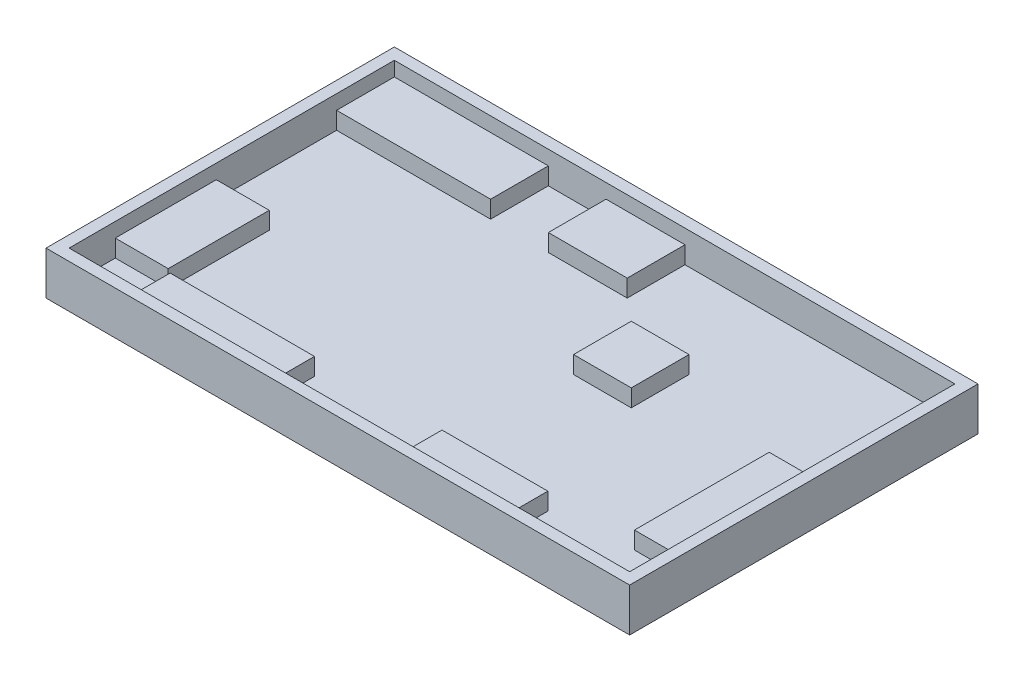
ISO-10303-21;
HEADER;
FILE_DESCRIPTION(('STEP AP214'),'2;1');
FILE_NAME('part.step','',(''),(''),'','','');
FILE_SCHEMA(('AUTOMOTIVE_DESIGN { 1 0 10303 214 1 1 1 1 }'));
ENDSEC;
DATA;
#1=APPLICATION_CONTEXT('core data for automotive mechanical design processes');
#2=APPLICATION_PROTOCOL_DEFINITION('international standard','automotive_design',2000,#1);
#3=PRODUCT_CONTEXT('',#1,'mechanical');
#4=PRODUCT('Part','Part','',(#3));
#5=PRODUCT_RELATED_PRODUCT_CATEGORY('part','',(#4));
#6=PRODUCT_DEFINITION_FORMATION('','',#4);
#7=PRODUCT_DEFINITION_CONTEXT('part definition',#1,'design');
#8=PRODUCT_DEFINITION('design','',#6,#7);
#9=PRODUCT_DEFINITION_SHAPE('','',#8);
#10=(LENGTH_UNIT() NAMED_UNIT(*) SI_UNIT(.MILLI.,.METRE.));
#11=(NAMED_UNIT(*) PLANE_ANGLE_UNIT() SI_UNIT($,.RADIAN.));
#12=(NAMED_UNIT(*) SI_UNIT($,.STERADIAN.) SOLID_ANGLE_UNIT());
#13=UNCERTAINTY_MEASURE_WITH_UNIT(LENGTH_MEASURE(1.E-05),#10,'distance_accuracy_value','');
#14=(GEOMETRIC_REPRESENTATION_CONTEXT(3) GLOBAL_UNCERTAINTY_ASSIGNED_CONTEXT((#13)) GLOBAL_UNIT_ASSIGNED_CONTEXT((#10,
#11,#12)) REPRESENTATION_CONTEXT('',''));
#15=CARTESIAN_POINT('',(0.,0.,0.));
#16=DIRECTION('',(0.,0.,1.));
#17=DIRECTION('',(1.,0.,0.));
#18=AXIS2_PLACEMENT_3D('',#15,#16,#17);
#19=CARTESIAN_POINT('',(0.,1.2,0.));
#20=DIRECTION('',(0.,1.,0.));
#21=DIRECTION('',(0.,0.,1.));
#22=AXIS2_PLACEMENT_3D('',#19,#20,#21);
#23=PLANE('',#22);
#24=DIRECTION('',(1.,0.,0.));
#25=VECTOR('',#24,1.);
#26=CARTESIAN_POINT('',(22.,1.2,-27.8));
#27=LINE('',#26,#25);
#28=CARTESIAN_POINT('',(22.,1.2,-27.8));
#29=VERTEX_POINT('',#28);
#30=CARTESIAN_POINT('',(30.2,1.2,-27.8));
#31=VERTEX_POINT('',#30);
#32=EDGE_CURVE('E63',#29,#31,#27,.T.);
#33=ORIENTED_EDGE('',*,*,#32,.F.);
#34=DIRECTION('',(0.,0.,1.));
#35=VECTOR('',#34,1.);
#36=CARTESIAN_POINT('',(22.,1.2,-33.8));
#37=LINE('',#36,#35);
#38=CARTESIAN_POINT('',(22.,1.2,-33.8));
#39=VERTEX_POINT('',#38);
#40=EDGE_CURVE('E295',#39,#29,#37,.T.);
#41=ORIENTED_EDGE('',*,*,#40,.F.);
#42=DIRECTION('',(-1.,0.,0.));
#43=VECTOR('',#42,1.);
#44=CARTESIAN_POINT('',(0.,1.2,-33.8));
#45=LINE('',#44,#43);
#46=CARTESIAN_POINT('',(16.,1.2,-33.8));
#47=VERTEX_POINT('',#46);
#48=EDGE_CURVE('E554',#39,#47,#45,.T.);
#49=ORIENTED_EDGE('',*,*,#48,.T.);
#50=DIRECTION('',(0.,0.,-1.));
#51=VECTOR('',#50,1.);
#52=CARTESIAN_POINT('',(16.,1.2,-33.8));
#53=LINE('',#52,#51);
#54=CARTESIAN_POINT('',(16.,1.2,-27.8));
#55=VERTEX_POINT('',#54);
#56=EDGE_CURVE('E498',#55,#47,#53,.T.);
#57=ORIENTED_EDGE('',*,*,#56,.F.);
#58=DIRECTION('',(1.,0.,0.));
#59=VECTOR('',#58,1.);
#60=CARTESIAN_POINT('',(0.,1.2,-27.8));
#61=LINE('',#60,#59);
#62=CARTESIAN_POINT('',(0.,1.2,-27.8));
#63=VERTEX_POINT('',#62);
#64=EDGE_CURVE('E492',#63,#55,#61,.T.);
#65=ORIENTED_EDGE('',*,*,#64,.F.);
#66=DIRECTION('',(0.,0.,1.));
#67=VECTOR('',#66,1.);
#68=CARTESIAN_POINT('',(0.,1.2,-33.8));
#69=LINE('',#68,#67);
#70=CARTESIAN_POINT('',(0.,1.2,-15.3));
#71=VERTEX_POINT('',#70);
#72=EDGE_CURVE('E539',#63,#71,#69,.T.);
#73=ORIENTED_EDGE('',*,*,#72,.T.);
#74=DIRECTION('',(-1.,0.,0.));
#75=VECTOR('',#74,1.);
#76=CARTESIAN_POINT('',(0.,1.2,-15.3));
#77=LINE('',#76,#75);
#78=CARTESIAN_POINT('',(5.5,1.2,-15.3));
#79=VERTEX_POINT('',#78);
#80=EDGE_CURVE('E461',#79,#71,#77,.T.);
#81=ORIENTED_EDGE('',*,*,#80,.F.);
#82=DIRECTION('',(0.,0.,-1.));
#83=VECTOR('',#82,1.);
#84=CARTESIAN_POINT('',(5.5,1.2,-4.8));
#85=LINE('',#84,#83);
#86=CARTESIAN_POINT('',(5.5,1.2,-4.8));
#87=VERTEX_POINT('',#86);
#88=EDGE_CURVE('E473',#87,#79,#85,.T.);
#89=ORIENTED_EDGE('',*,*,#88,.F.);
#90=DIRECTION('',(1.,0.,0.));
#91=VECTOR('',#90,1.);
#92=CARTESIAN_POINT('',(0.,1.2,-4.8));
#93=LINE('',#92,#91);
#94=CARTESIAN_POINT('',(0.,1.2,-4.8));
#95=VERTEX_POINT('',#94);
#96=EDGE_CURVE('E455',#95,#87,#93,.T.);
#97=ORIENTED_EDGE('',*,*,#96,.F.);
#98=CARTESIAN_POINT('',(0.,1.2,0.));
#99=VERTEX_POINT('',#98);
#100=EDGE_CURVE('E523',#95,#99,#69,.T.);
#101=ORIENTED_EDGE('',*,*,#100,.T.);
#102=DIRECTION('',(1.,0.,0.));
#103=VECTOR('',#102,1.);
#104=CARTESIAN_POINT('',(0.,1.2,0.));
#105=LINE('',#104,#103);
#106=CARTESIAN_POINT('',(6.,1.2,0.));
#107=VERTEX_POINT('',#106);
#108=EDGE_CURVE('E544',#99,#107,#105,.T.);
#109=ORIENTED_EDGE('',*,*,#108,.T.);
#110=DIRECTION('',(0.,0.,1.));
#111=VECTOR('',#110,1.);
#112=CARTESIAN_POINT('',(6.,1.2,0.));
#113=LINE('',#112,#111);
#114=CARTESIAN_POINT('',(6.,1.2,-4.5));
#115=VERTEX_POINT('',#114);
#116=EDGE_CURVE('E339',#115,#107,#113,.T.);
#117=ORIENTED_EDGE('',*,*,#116,.F.);
#118=DIRECTION('',(-1.,0.,0.));
#119=VECTOR('',#118,1.);
#120=CARTESIAN_POINT('',(6.,1.2,-4.5));
#121=LINE('',#120,#119);
#122=CARTESIAN_POINT('',(21.,1.2,-4.5));
#123=VERTEX_POINT('',#122);
#124=EDGE_CURVE('E345',#123,#115,#121,.T.);
#125=ORIENTED_EDGE('',*,*,#124,.F.);
#126=DIRECTION('',(0.,0.,-1.));
#127=VECTOR('',#126,1.);
#128=CARTESIAN_POINT('',(21.,1.2,0.));
#129=LINE('',#128,#127);
#130=CARTESIAN_POINT('',(21.,1.2,0.));
#131=VERTEX_POINT('',#130);
#132=EDGE_CURVE('E357',#131,#123,#129,.T.);
#133=ORIENTED_EDGE('',*,*,#132,.F.);
#134=CARTESIAN_POINT('',(34.25,1.2,0.));
#135=VERTEX_POINT('',#134);
#136=EDGE_CURVE('E549',#131,#135,#105,.T.);
#137=ORIENTED_EDGE('',*,*,#136,.T.);
#138=DIRECTION('',(0.,0.,1.));
#139=VECTOR('',#138,1.);
#140=CARTESIAN_POINT('',(34.25,1.2,0.));
#141=LINE('',#140,#139);
#142=CARTESIAN_POINT('',(34.25,1.2,-4.5));
#143=VERTEX_POINT('',#142);
#144=EDGE_CURVE('E417',#143,#135,#141,.T.);
#145=ORIENTED_EDGE('',*,*,#144,.F.);
#146=DIRECTION('',(-1.,0.,0.));
#147=VECTOR('',#146,1.);
#148=CARTESIAN_POINT('',(34.25,1.2,-4.5));
#149=LINE('',#148,#147);
#150=CARTESIAN_POINT('',(45.25,1.2,-4.5));
#151=VERTEX_POINT('',#150);
#152=EDGE_CURVE('E423',#151,#143,#149,.T.);
#153=ORIENTED_EDGE('',*,*,#152,.F.);
#154=DIRECTION('',(0.,0.,-1.));
#155=VECTOR('',#154,1.);
#156=CARTESIAN_POINT('',(45.25,1.2,0.));
#157=LINE('',#156,#155);
#158=CARTESIAN_POINT('',(45.25,1.2,0.));
#159=VERTEX_POINT('',#158);
#160=EDGE_CURVE('E436',#159,#151,#157,.T.);
#161=ORIENTED_EDGE('',*,*,#160,.F.);
#162=CARTESIAN_POINT('',(58.25,1.2,0.));
#163=VERTEX_POINT('',#162);
#164=EDGE_CURVE('E543',#159,#163,#105,.T.);
#165=ORIENTED_EDGE('',*,*,#164,.T.);
#166=DIRECTION('',(0.,0.,-1.));
#167=VECTOR('',#166,1.);
#168=CARTESIAN_POINT('',(58.25,1.2,-33.8));
#169=LINE('',#168,#167);
#170=CARTESIAN_POINT('',(58.25,1.2,-5.5));
#171=VERTEX_POINT('',#170);
#172=EDGE_CURVE('E550',#163,#171,#169,.T.);
#173=ORIENTED_EDGE('',*,*,#172,.T.);
#174=DIRECTION('',(1.,0.,0.));
#175=VECTOR('',#174,1.);
#176=CARTESIAN_POINT('',(58.25,1.2,-5.5));
#177=LINE('',#176,#175);
#178=CARTESIAN_POINT('',(53.25,1.2,-5.5));
#179=VERTEX_POINT('',#178);
#180=EDGE_CURVE('E382',#179,#171,#177,.T.);
#181=ORIENTED_EDGE('',*,*,#180,.F.);
#182=DIRECTION('',(0.,0.,1.));
#183=VECTOR('',#182,1.);
#184=CARTESIAN_POINT('',(53.25,1.2,-5.5));
#185=LINE('',#184,#183);
#186=CARTESIAN_POINT('',(53.25,1.2,-19.5));
#187=VERTEX_POINT('',#186);
#188=EDGE_CURVE('E396',#187,#179,#185,.T.);
#189=ORIENTED_EDGE('',*,*,#188,.F.);
#190=DIRECTION('',(-1.,0.,0.));
#191=VECTOR('',#190,1.);
#192=CARTESIAN_POINT('',(58.25,1.2,-19.5));
#193=LINE('',#192,#191);
#194=CARTESIAN_POINT('',(58.25,1.2,-19.5));
#195=VERTEX_POINT('',#194);
#196=EDGE_CURVE('E376',#195,#187,#193,.T.);
#197=ORIENTED_EDGE('',*,*,#196,.F.);
#198=CARTESIAN_POINT('',(58.25,1.2,-33.8));
#199=VERTEX_POINT('',#198);
#200=EDGE_CURVE('E548',#195,#199,#169,.T.);
#201=ORIENTED_EDGE('',*,*,#200,.T.);
#202=CARTESIAN_POINT('',(30.2,1.2,-33.8));
#203=VERTEX_POINT('',#202);
#204=EDGE_CURVE('E528',#199,#203,#45,.T.);
#205=ORIENTED_EDGE('',*,*,#204,.T.);
#206=DIRECTION('',(0.,0.,-1.));
#207=VECTOR('',#206,1.);
#208=CARTESIAN_POINT('',(30.2,1.2,-33.8));
#209=LINE('',#208,#207);
#210=EDGE_CURVE('E309',#31,#203,#209,.T.);
#211=ORIENTED_EDGE('',*,*,#210,.F.);
#212=EDGE_LOOP('',(#33,#41,#49,#57,#65,#73,#81,#89,#97,#101,#109,#117,#125,#133,#137,#145,#153,
#161,#165,#173,#181,#189,#197,#201,#205,#211));
#213=FACE_BOUND('',#212,.T.);
#214=DIRECTION('',(1.,0.,0.));
#215=VECTOR('',#214,1.);
#216=CARTESIAN_POINT('',(34.29,1.2,-18.13));
#217=LINE('',#216,#215);
#218=CARTESIAN_POINT('',(34.29,1.2,-18.13));
#219=VERTEX_POINT('',#218);
#220=CARTESIAN_POINT('',(40.29,1.2,-18.13));
#221=VERTEX_POINT('',#220);
#222=EDGE_CURVE('E1088',#219,#221,#217,.T.);
#223=ORIENTED_EDGE('',*,*,#222,.F.);
#224=DIRECTION('',(0.,0.,1.));
#225=VECTOR('',#224,1.);
#226=CARTESIAN_POINT('',(34.29,1.2,-24.13));
#227=LINE('',#226,#225);
#228=CARTESIAN_POINT('',(34.29,1.2,-24.13));
#229=VERTEX_POINT('',#228);
#230=EDGE_CURVE('E292',#229,#219,#227,.T.);
#231=ORIENTED_EDGE('',*,*,#230,.F.);
#232=DIRECTION('',(-1.,0.,0.));
#233=VECTOR('',#232,1.);
#234=CARTESIAN_POINT('',(34.29,1.2,-24.13));
#235=LINE('',#234,#233);
#236=CARTESIAN_POINT('',(40.29,1.2,-24.13));
#237=VERTEX_POINT('',#236);
#238=EDGE_CURVE('E288',#237,#229,#235,.T.);
#239=ORIENTED_EDGE('',*,*,#238,.F.);
#240=DIRECTION('',(0.,0.,-1.));
#241=VECTOR('',#240,1.);
#242=CARTESIAN_POINT('',(40.29,1.2,-24.13));
#243=LINE('',#242,#241);
#244=EDGE_CURVE('E1084',#221,#237,#243,.T.);
#245=ORIENTED_EDGE('',*,*,#244,.F.);
#246=EDGE_LOOP('',(#223,#231,#239,#245));
#247=FACE_BOUND('',#246,.T.);
#248=ADVANCED_FACE('F39',(#213,#247),#23,.T.);
#249=CARTESIAN_POINT('',(0.,4.5,-33.8));
#250=DIRECTION('',(0.,0.,1.));
#251=DIRECTION('',(1.,0.,0.));
#252=AXIS2_PLACEMENT_3D('',#249,#250,#251);
#253=PLANE('',#252);
#254=ORIENTED_EDGE('',*,*,#48,.F.);
#255=DIRECTION('',(0.,-1.,0.));
#256=VECTOR('',#255,1.);
#257=CARTESIAN_POINT('',(22.,3.,-33.8));
#258=LINE('',#257,#256);
#259=CARTESIAN_POINT('',(22.,3.,-33.8));
#260=VERTEX_POINT('',#259);
#261=EDGE_CURVE('E319',#260,#39,#258,.T.);
#262=ORIENTED_EDGE('',*,*,#261,.F.);
#263=DIRECTION('',(-1.,0.,0.));
#264=VECTOR('',#263,1.);
#265=CARTESIAN_POINT('',(22.,3.,-33.8));
#266=LINE('',#265,#264);
#267=CARTESIAN_POINT('',(30.2,3.,-33.8));
#268=VERTEX_POINT('',#267);
#269=EDGE_CURVE('E316',#268,#260,#266,.T.);
#270=ORIENTED_EDGE('',*,*,#269,.F.);
#271=DIRECTION('',(0.,-1.,0.));
#272=VECTOR('',#271,1.);
#273=CARTESIAN_POINT('',(30.2,3.,-33.8));
#274=LINE('',#273,#272);
#275=EDGE_CURVE('E329',#268,#203,#274,.T.);
#276=ORIENTED_EDGE('',*,*,#275,.T.);
#277=ORIENTED_EDGE('',*,*,#204,.F.);
#278=DIRECTION('',(0.,-1.,0.));
#279=VECTOR('',#278,1.);
#280=CARTESIAN_POINT('',(58.25,4.5,-33.8));
#281=LINE('',#280,#279);
#282=CARTESIAN_POINT('',(58.25,4.5,-33.8));
#283=VERTEX_POINT('',#282);
#284=EDGE_CURVE('E561',#283,#199,#281,.T.);
#285=ORIENTED_EDGE('',*,*,#284,.F.);
#286=DIRECTION('',(-1.,0.,0.));
#287=VECTOR('',#286,1.);
#288=CARTESIAN_POINT('',(0.,4.5,-33.8));
#289=LINE('',#288,#287);
#290=CARTESIAN_POINT('',(0.,4.5,-33.8));
#291=VERTEX_POINT('',#290);
#292=EDGE_CURVE('E535',#283,#291,#289,.T.);
#293=ORIENTED_EDGE('',*,*,#292,.T.);
#294=DIRECTION('',(0.,-1.,0.));
#295=VECTOR('',#294,1.);
#296=CARTESIAN_POINT('',(0.,4.5,-33.8));
#297=LINE('',#296,#295);
#298=CARTESIAN_POINT('',(0.,3.,-33.8));
#299=VERTEX_POINT('',#298);
#300=EDGE_CURVE('E538',#291,#299,#297,.T.);
#301=ORIENTED_EDGE('',*,*,#300,.T.);
#302=DIRECTION('',(-1.,0.,0.));
#303=VECTOR('',#302,1.);
#304=CARTESIAN_POINT('',(0.,3.,-33.8));
#305=LINE('',#304,#303);
#306=CARTESIAN_POINT('',(16.,3.,-33.8));
#307=VERTEX_POINT('',#306);
#308=EDGE_CURVE('E504',#307,#299,#305,.T.);
#309=ORIENTED_EDGE('',*,*,#308,.F.);
#310=DIRECTION('',(0.,-1.,0.));
#311=VECTOR('',#310,1.);
#312=CARTESIAN_POINT('',(16.,3.,-33.8));
#313=LINE('',#312,#311);
#314=EDGE_CURVE('E507',#307,#47,#313,.T.);
#315=ORIENTED_EDGE('',*,*,#314,.T.);
#316=EDGE_LOOP('',(#254,#262,#270,#276,#277,#285,#293,#301,#309,#315));
#317=FACE_BOUND('',#316,.T.);
#318=ADVANCED_FACE('F638',(#317),#253,.T.);
#319=CARTESIAN_POINT('',(0.,4.5,0.));
#320=DIRECTION('',(0.,0.,-1.));
#321=DIRECTION('',(-1.,0.,0.));
#322=AXIS2_PLACEMENT_3D('',#319,#320,#321);
#323=PLANE('',#322);
#324=DIRECTION('',(1.,0.,0.));
#325=VECTOR('',#324,1.);
#326=CARTESIAN_POINT('',(6.,3.,0.));
#327=LINE('',#326,#325);
#328=CARTESIAN_POINT('',(6.,3.,0.));
#329=VERTEX_POINT('',#328);
#330=CARTESIAN_POINT('',(21.,3.,0.));
#331=VERTEX_POINT('',#330);
#332=EDGE_CURVE('E344',#329,#331,#327,.T.);
#333=ORIENTED_EDGE('',*,*,#332,.F.);
#334=DIRECTION('',(0.,-1.,0.));
#335=VECTOR('',#334,1.);
#336=CARTESIAN_POINT('',(6.,3.,0.));
#337=LINE('',#336,#335);
#338=EDGE_CURVE('E372',#329,#107,#337,.T.);
#339=ORIENTED_EDGE('',*,*,#338,.T.);
#340=ORIENTED_EDGE('',*,*,#108,.F.);
#341=DIRECTION('',(0.,-1.,0.));
#342=VECTOR('',#341,1.);
#343=CARTESIAN_POINT('',(0.,4.5,0.));
#344=LINE('',#343,#342);
#345=CARTESIAN_POINT('',(0.,4.5,0.));
#346=VERTEX_POINT('',#345);
#347=EDGE_CURVE('E569',#346,#99,#344,.T.);
#348=ORIENTED_EDGE('',*,*,#347,.F.);
#349=DIRECTION('',(1.,0.,0.));
#350=VECTOR('',#349,1.);
#351=CARTESIAN_POINT('',(0.,4.5,0.));
#352=LINE('',#351,#350);
#353=CARTESIAN_POINT('',(58.25,4.5,0.));
#354=VERTEX_POINT('',#353);
#355=EDGE_CURVE('E527',#346,#354,#352,.T.);
#356=ORIENTED_EDGE('',*,*,#355,.T.);
#357=DIRECTION('',(0.,-1.,0.));
#358=VECTOR('',#357,1.);
#359=CARTESIAN_POINT('',(58.25,4.5,0.));
#360=LINE('',#359,#358);
#361=EDGE_CURVE('E565',#354,#163,#360,.T.);
#362=ORIENTED_EDGE('',*,*,#361,.T.);
#363=ORIENTED_EDGE('',*,*,#164,.F.);
#364=DIRECTION('',(0.,-1.,0.));
#365=VECTOR('',#364,1.);
#366=CARTESIAN_POINT('',(45.25,3.,0.));
#367=LINE('',#366,#365);
#368=CARTESIAN_POINT('',(45.25,3.,0.));
#369=VERTEX_POINT('',#368);
#370=EDGE_CURVE('E448',#369,#159,#367,.T.);
#371=ORIENTED_EDGE('',*,*,#370,.F.);
#372=DIRECTION('',(1.,0.,0.));
#373=VECTOR('',#372,1.);
#374=CARTESIAN_POINT('',(34.25,3.,0.));
#375=LINE('',#374,#373);
#376=CARTESIAN_POINT('',(34.25,3.,0.));
#377=VERTEX_POINT('',#376);
#378=EDGE_CURVE('E422',#377,#369,#375,.T.);
#379=ORIENTED_EDGE('',*,*,#378,.F.);
#380=DIRECTION('',(0.,-1.,0.));
#381=VECTOR('',#380,1.);
#382=CARTESIAN_POINT('',(34.25,3.,0.));
#383=LINE('',#382,#381);
#384=EDGE_CURVE('E451',#377,#135,#383,.T.);
#385=ORIENTED_EDGE('',*,*,#384,.T.);
#386=ORIENTED_EDGE('',*,*,#136,.F.);
#387=DIRECTION('',(0.,-1.,0.));
#388=VECTOR('',#387,1.);
#389=CARTESIAN_POINT('',(21.,3.,0.));
#390=LINE('',#389,#388);
#391=EDGE_CURVE('E369',#331,#131,#390,.T.);
#392=ORIENTED_EDGE('',*,*,#391,.F.);
#393=EDGE_LOOP('',(#333,#339,#340,#348,#356,#362,#363,#371,#379,#385,#386,#392));
#394=FACE_BOUND('',#393,.T.);
#395=ADVANCED_FACE('F643',(#394),#323,.T.);
#396=CARTESIAN_POINT('',(58.25,4.5,-33.8));
#397=DIRECTION('',(-1.,0.,0.));
#398=DIRECTION('',(0.,0.,1.));
#399=AXIS2_PLACEMENT_3D('',#396,#397,#398);
#400=PLANE('',#399);
#401=ORIENTED_EDGE('',*,*,#200,.F.);
#402=DIRECTION('',(0.,-1.,0.));
#403=VECTOR('',#402,1.);
#404=CARTESIAN_POINT('',(58.25,3.,-19.5));
#405=LINE('',#404,#403);
#406=CARTESIAN_POINT('',(58.25,3.,-19.5));
#407=VERTEX_POINT('',#406);
#408=EDGE_CURVE('E413',#407,#195,#405,.T.);
#409=ORIENTED_EDGE('',*,*,#408,.F.);
#410=DIRECTION('',(0.,0.,-1.));
#411=VECTOR('',#410,1.);
#412=CARTESIAN_POINT('',(58.25,3.,-5.5));
#413=LINE('',#412,#411);
#414=CARTESIAN_POINT('',(58.25,3.,-5.5));
#415=VERTEX_POINT('',#414);
#416=EDGE_CURVE('E377',#415,#407,#413,.T.);
#417=ORIENTED_EDGE('',*,*,#416,.F.);
#418=DIRECTION('',(0.,-1.,0.));
#419=VECTOR('',#418,1.);
#420=CARTESIAN_POINT('',(58.25,3.,-5.5));
#421=LINE('',#420,#419);
#422=EDGE_CURVE('E392',#415,#171,#421,.T.);
#423=ORIENTED_EDGE('',*,*,#422,.T.);
#424=ORIENTED_EDGE('',*,*,#172,.F.);
#425=ORIENTED_EDGE('',*,*,#361,.F.);
#426=DIRECTION('',(0.,0.,-1.));
#427=VECTOR('',#426,1.);
#428=CARTESIAN_POINT('',(58.25,4.5,-33.8));
#429=LINE('',#428,#427);
#430=EDGE_CURVE('E531',#354,#283,#429,.T.);
#431=ORIENTED_EDGE('',*,*,#430,.T.);
#432=ORIENTED_EDGE('',*,*,#284,.T.);
#433=EDGE_LOOP('',(#401,#409,#417,#423,#424,#425,#431,#432));
#434=FACE_BOUND('',#433,.T.);
#435=ADVANCED_FACE('F958',(#434),#400,.T.);
#436=CARTESIAN_POINT('',(0.,4.5,-33.8));
#437=DIRECTION('',(1.,0.,0.));
#438=DIRECTION('',(0.,0.,-1.));
#439=AXIS2_PLACEMENT_3D('',#436,#437,#438);
#440=PLANE('',#439);
#441=ORIENTED_EDGE('',*,*,#100,.F.);
#442=DIRECTION('',(0.,-1.,0.));
#443=VECTOR('',#442,1.);
#444=CARTESIAN_POINT('',(0.,3.,-4.8));
#445=LINE('',#444,#443);
#446=CARTESIAN_POINT('',(0.,3.,-4.8));
#447=VERTEX_POINT('',#446);
#448=EDGE_CURVE('E489',#447,#95,#445,.T.);
#449=ORIENTED_EDGE('',*,*,#448,.F.);
#450=DIRECTION('',(0.,0.,1.));
#451=VECTOR('',#450,1.);
#452=CARTESIAN_POINT('',(0.,3.,-4.8));
#453=LINE('',#452,#451);
#454=CARTESIAN_POINT('',(0.,3.,-15.3));
#455=VERTEX_POINT('',#454);
#456=EDGE_CURVE('E456',#455,#447,#453,.T.);
#457=ORIENTED_EDGE('',*,*,#456,.F.);
#458=DIRECTION('',(0.,-1.,0.));
#459=VECTOR('',#458,1.);
#460=CARTESIAN_POINT('',(0.,3.,-15.3));
#461=LINE('',#460,#459);
#462=EDGE_CURVE('E470',#455,#71,#461,.T.);
#463=ORIENTED_EDGE('',*,*,#462,.T.);
#464=ORIENTED_EDGE('',*,*,#72,.F.);
#465=DIRECTION('',(0.,-1.,0.));
#466=VECTOR('',#465,1.);
#467=CARTESIAN_POINT('',(0.,3.,-27.8));
#468=LINE('',#467,#466);
#469=CARTESIAN_POINT('',(0.,3.,-27.8));
#470=VERTEX_POINT('',#469);
#471=EDGE_CURVE('E520',#470,#63,#468,.T.);
#472=ORIENTED_EDGE('',*,*,#471,.F.);
#473=DIRECTION('',(0.,0.,1.));
#474=VECTOR('',#473,1.);
#475=CARTESIAN_POINT('',(0.,3.,-33.8));
#476=LINE('',#475,#474);
#477=EDGE_CURVE('E493',#299,#470,#476,.T.);
#478=ORIENTED_EDGE('',*,*,#477,.F.);
#479=ORIENTED_EDGE('',*,*,#300,.F.);
#480=DIRECTION('',(0.,0.,1.));
#481=VECTOR('',#480,1.);
#482=CARTESIAN_POINT('',(0.,4.5,-33.8));
#483=LINE('',#482,#481);
#484=EDGE_CURVE('E524',#291,#346,#483,.T.);
#485=ORIENTED_EDGE('',*,*,#484,.T.);
#486=ORIENTED_EDGE('',*,*,#347,.T.);
#487=EDGE_LOOP('',(#441,#449,#457,#463,#464,#472,#478,#479,#485,#486));
#488=FACE_BOUND('',#487,.T.);
#489=ADVANCED_FACE('F636',(#488),#440,.T.);
#490=CARTESIAN_POINT('',(-1.2,1.2,-35.));
#491=DIRECTION('',(1.,0.,0.));
#492=DIRECTION('',(0.,0.,-1.));
#493=AXIS2_PLACEMENT_3D('',#490,#491,#492);
#494=PLANE('',#493);
#495=DIRECTION('',(0.,0.,1.));
#496=VECTOR('',#495,1.);
#497=CARTESIAN_POINT('',(-1.2,0.,-35.));
#498=LINE('',#497,#496);
#499=CARTESIAN_POINT('',(-1.2,0.,-35.));
#500=VERTEX_POINT('',#499);
#501=CARTESIAN_POINT('',(-1.2,0.,1.2));
#502=VERTEX_POINT('',#501);
#503=EDGE_CURVE('E589',#500,#502,#498,.T.);
#504=ORIENTED_EDGE('',*,*,#503,.T.);
#505=DIRECTION('',(0.,-1.,0.));
#506=VECTOR('',#505,1.);
#507=CARTESIAN_POINT('',(-1.2,1.2,1.2));
#508=LINE('',#507,#506);
#509=CARTESIAN_POINT('',(-1.2,4.5,1.2));
#510=VERTEX_POINT('',#509);
#511=EDGE_CURVE('E11',#510,#502,#508,.T.);
#512=ORIENTED_EDGE('',*,*,#511,.F.);
#513=DIRECTION('',(0.,0.,1.));
#514=VECTOR('',#513,1.);
#515=CARTESIAN_POINT('',(-1.2,4.5,-35.));
#516=LINE('',#515,#514);
#517=CARTESIAN_POINT('',(-1.2,4.5,-35.));
#518=VERTEX_POINT('',#517);
#519=EDGE_CURVE('E573',#518,#510,#516,.T.);
#520=ORIENTED_EDGE('',*,*,#519,.F.);
#521=DIRECTION('',(0.,-1.,0.));
#522=VECTOR('',#521,1.);
#523=CARTESIAN_POINT('',(-1.2,1.2,-35.));
#524=LINE('',#523,#522);
#525=EDGE_CURVE('E602',#518,#500,#524,.T.);
#526=ORIENTED_EDGE('',*,*,#525,.T.);
#527=EDGE_LOOP('',(#504,#512,#520,#526));
#528=FACE_BOUND('',#527,.T.);
#529=ADVANCED_FACE('F41',(#528),#494,.F.);
#530=CARTESIAN_POINT('',(-1.2,1.2,1.2));
#531=DIRECTION('',(0.,0.,-1.));
#532=DIRECTION('',(-1.,0.,0.));
#533=AXIS2_PLACEMENT_3D('',#530,#531,#532);
#534=PLANE('',#533);
#535=DIRECTION('',(1.,0.,0.));
#536=VECTOR('',#535,1.);
#537=CARTESIAN_POINT('',(-1.2,0.,1.2));
#538=LINE('',#537,#536);
#539=CARTESIAN_POINT('',(59.45,0.,1.2));
#540=VERTEX_POINT('',#539);
#541=EDGE_CURVE('E593',#502,#540,#538,.T.);
#542=ORIENTED_EDGE('',*,*,#541,.T.);
#543=DIRECTION('',(0.,-1.,0.));
#544=VECTOR('',#543,1.);
#545=CARTESIAN_POINT('',(59.45,1.2,1.2));
#546=LINE('',#545,#544);
#547=CARTESIAN_POINT('',(59.45,4.5,1.2));
#548=VERTEX_POINT('',#547);
#549=EDGE_CURVE('E48',#548,#540,#546,.T.);
#550=ORIENTED_EDGE('',*,*,#549,.F.);
#551=DIRECTION('',(1.,0.,0.));
#552=VECTOR('',#551,1.);
#553=CARTESIAN_POINT('',(-1.2,4.5,1.2));
#554=LINE('',#553,#552);
#555=EDGE_CURVE('E577',#510,#548,#554,.T.);
#556=ORIENTED_EDGE('',*,*,#555,.F.);
#557=ORIENTED_EDGE('',*,*,#511,.T.);
#558=EDGE_LOOP('',(#542,#550,#556,#557));
#559=FACE_BOUND('',#558,.T.);
#560=ADVANCED_FACE('F629',(#559),#534,.F.);
#561=CARTESIAN_POINT('',(59.45,1.2,-35.));
#562=DIRECTION('',(-1.,0.,0.));
#563=DIRECTION('',(0.,0.,1.));
#564=AXIS2_PLACEMENT_3D('',#561,#562,#563);
#565=PLANE('',#564);
#566=DIRECTION('',(0.,0.,-1.));
#567=VECTOR('',#566,1.);
#568=CARTESIAN_POINT('',(59.45,0.,-35.));
#569=LINE('',#568,#567);
#570=CARTESIAN_POINT('',(59.45,0.,-35.));
#571=VERTEX_POINT('',#570);
#572=EDGE_CURVE('E596',#540,#571,#569,.T.);
#573=ORIENTED_EDGE('',*,*,#572,.T.);
#574=DIRECTION('',(0.,-1.,0.));
#575=VECTOR('',#574,1.);
#576=CARTESIAN_POINT('',(59.45,1.2,-35.));
#577=LINE('',#576,#575);
#578=CARTESIAN_POINT('',(59.45,4.5,-35.));
#579=VERTEX_POINT('',#578);
#580=EDGE_CURVE('E606',#579,#571,#577,.T.);
#581=ORIENTED_EDGE('',*,*,#580,.F.);
#582=DIRECTION('',(0.,0.,-1.));
#583=VECTOR('',#582,1.);
#584=CARTESIAN_POINT('',(59.45,4.5,-35.));
#585=LINE('',#584,#583);
#586=EDGE_CURVE('E581',#548,#579,#585,.T.);
#587=ORIENTED_EDGE('',*,*,#586,.F.);
#588=ORIENTED_EDGE('',*,*,#549,.T.);
#589=EDGE_LOOP('',(#573,#581,#587,#588));
#590=FACE_BOUND('',#589,.T.);
#591=ADVANCED_FACE('F614',(#590),#565,.F.);
#592=CARTESIAN_POINT('',(-1.2,1.2,-35.));
#593=DIRECTION('',(0.,0.,1.));
#594=DIRECTION('',(1.,0.,0.));
#595=AXIS2_PLACEMENT_3D('',#592,#593,#594);
#596=PLANE('',#595);
#597=DIRECTION('',(-1.,0.,0.));
#598=VECTOR('',#597,1.);
#599=CARTESIAN_POINT('',(-1.2,0.,-35.));
#600=LINE('',#599,#598);
#601=EDGE_CURVE('E599',#571,#500,#600,.T.);
#602=ORIENTED_EDGE('',*,*,#601,.T.);
#603=ORIENTED_EDGE('',*,*,#525,.F.);
#604=DIRECTION('',(-1.,0.,0.));
#605=VECTOR('',#604,1.);
#606=CARTESIAN_POINT('',(-1.2,4.5,-35.));
#607=LINE('',#606,#605);
#608=EDGE_CURVE('E585',#579,#518,#607,.T.);
#609=ORIENTED_EDGE('',*,*,#608,.F.);
#610=ORIENTED_EDGE('',*,*,#580,.T.);
#611=EDGE_LOOP('',(#602,#603,#609,#610));
#612=FACE_BOUND('',#611,.T.);
#613=ADVANCED_FACE('F622',(#612),#596,.F.);
#614=CARTESIAN_POINT('',(0.,0.,0.));
#615=DIRECTION('',(0.,1.,0.));
#616=DIRECTION('',(0.,0.,1.));
#617=AXIS2_PLACEMENT_3D('',#614,#615,#616);
#618=PLANE('',#617);
#619=ORIENTED_EDGE('',*,*,#503,.F.);
#620=ORIENTED_EDGE('',*,*,#601,.F.);
#621=ORIENTED_EDGE('',*,*,#572,.F.);
#622=ORIENTED_EDGE('',*,*,#541,.F.);
#623=EDGE_LOOP('',(#619,#620,#621,#622));
#624=FACE_BOUND('',#623,.T.);
#625=ADVANCED_FACE('F620',(#624),#618,.F.);
#626=CARTESIAN_POINT('',(0.,4.5,0.));
#627=DIRECTION('',(0.,1.,0.));
#628=DIRECTION('',(0.,0.,1.));
#629=AXIS2_PLACEMENT_3D('',#626,#627,#628);
#630=PLANE('',#629);
#631=ORIENTED_EDGE('',*,*,#519,.T.);
#632=ORIENTED_EDGE('',*,*,#555,.T.);
#633=ORIENTED_EDGE('',*,*,#586,.T.);
#634=ORIENTED_EDGE('',*,*,#608,.T.);
#635=EDGE_LOOP('',(#631,#632,#633,#634));
#636=FACE_BOUND('',#635,.T.);
#637=ORIENTED_EDGE('',*,*,#355,.F.);
#638=ORIENTED_EDGE('',*,*,#484,.F.);
#639=ORIENTED_EDGE('',*,*,#292,.F.);
#640=ORIENTED_EDGE('',*,*,#430,.F.);
#641=EDGE_LOOP('',(#637,#638,#639,#640));
#642=FACE_BOUND('',#641,.T.);
#643=ADVANCED_FACE('F627',(#636,#642),#630,.T.);
#644=CARTESIAN_POINT('',(0.,3.,-27.8));
#645=DIRECTION('',(0.,0.,-1.));
#646=DIRECTION('',(-1.,0.,0.));
#647=AXIS2_PLACEMENT_3D('',#644,#645,#646);
#648=PLANE('',#647);
#649=ORIENTED_EDGE('',*,*,#64,.T.);
#650=DIRECTION('',(0.,-1.,0.));
#651=VECTOR('',#650,1.);
#652=CARTESIAN_POINT('',(16.,3.,-27.8));
#653=LINE('',#652,#651);
#654=CARTESIAN_POINT('',(16.,3.,-27.8));
#655=VERTEX_POINT('',#654);
#656=EDGE_CURVE('E517',#655,#55,#653,.T.);
#657=ORIENTED_EDGE('',*,*,#656,.F.);
#658=DIRECTION('',(1.,0.,0.));
#659=VECTOR('',#658,1.);
#660=CARTESIAN_POINT('',(0.,3.,-27.8));
#661=LINE('',#660,#659);
#662=EDGE_CURVE('E497',#470,#655,#661,.T.);
#663=ORIENTED_EDGE('',*,*,#662,.F.);
#664=ORIENTED_EDGE('',*,*,#471,.T.);
#665=EDGE_LOOP('',(#649,#657,#663,#664));
#666=FACE_BOUND('',#665,.T.);
#667=ADVANCED_FACE('F668',(#666),#648,.F.);
#668=CARTESIAN_POINT('',(16.,3.,-33.8));
#669=DIRECTION('',(-1.,0.,0.));
#670=DIRECTION('',(0.,0.,1.));
#671=AXIS2_PLACEMENT_3D('',#668,#669,#670);
#672=PLANE('',#671);
#673=ORIENTED_EDGE('',*,*,#56,.T.);
#674=ORIENTED_EDGE('',*,*,#314,.F.);
#675=DIRECTION('',(0.,0.,-1.));
#676=VECTOR('',#675,1.);
#677=CARTESIAN_POINT('',(16.,3.,-33.8));
#678=LINE('',#677,#676);
#679=EDGE_CURVE('E501',#655,#307,#678,.T.);
#680=ORIENTED_EDGE('',*,*,#679,.F.);
#681=ORIENTED_EDGE('',*,*,#656,.T.);
#682=EDGE_LOOP('',(#673,#674,#680,#681));
#683=FACE_BOUND('',#682,.T.);
#684=ADVANCED_FACE('F674',(#683),#672,.F.);
#685=CARTESIAN_POINT('',(0.,3.,0.));
#686=DIRECTION('',(0.,1.,0.));
#687=DIRECTION('',(0.,0.,1.));
#688=AXIS2_PLACEMENT_3D('',#685,#686,#687);
#689=PLANE('',#688);
#690=ORIENTED_EDGE('',*,*,#477,.T.);
#691=ORIENTED_EDGE('',*,*,#662,.T.);
#692=ORIENTED_EDGE('',*,*,#679,.T.);
#693=ORIENTED_EDGE('',*,*,#308,.T.);
#694=EDGE_LOOP('',(#690,#691,#692,#693));
#695=FACE_BOUND('',#694,.T.);
#696=ADVANCED_FACE('F683',(#695),#689,.T.);
#697=CARTESIAN_POINT('',(0.,3.,-4.8));
#698=DIRECTION('',(0.,0.,-1.));
#699=DIRECTION('',(-1.,0.,0.));
#700=AXIS2_PLACEMENT_3D('',#697,#698,#699);
#701=PLANE('',#700);
#702=ORIENTED_EDGE('',*,*,#96,.T.);
#703=DIRECTION('',(0.,-1.,0.));
#704=VECTOR('',#703,1.);
#705=CARTESIAN_POINT('',(5.5,3.,-4.8));
#706=LINE('',#705,#704);
#707=CARTESIAN_POINT('',(5.5,3.,-4.8));
#708=VERTEX_POINT('',#707);
#709=EDGE_CURVE('E485',#708,#87,#706,.T.);
#710=ORIENTED_EDGE('',*,*,#709,.F.);
#711=DIRECTION('',(1.,0.,0.));
#712=VECTOR('',#711,1.);
#713=CARTESIAN_POINT('',(0.,3.,-4.8));
#714=LINE('',#713,#712);
#715=EDGE_CURVE('E460',#447,#708,#714,.T.);
#716=ORIENTED_EDGE('',*,*,#715,.F.);
#717=ORIENTED_EDGE('',*,*,#448,.T.);
#718=EDGE_LOOP('',(#702,#710,#716,#717));
#719=FACE_BOUND('',#718,.T.);
#720=ADVANCED_FACE('F691',(#719),#701,.F.);
#721=CARTESIAN_POINT('',(5.5,3.,-4.8));
#722=DIRECTION('',(-1.,0.,0.));
#723=DIRECTION('',(0.,0.,1.));
#724=AXIS2_PLACEMENT_3D('',#721,#722,#723);
#725=PLANE('',#724);
#726=ORIENTED_EDGE('',*,*,#88,.T.);
#727=DIRECTION('',(0.,-1.,0.));
#728=VECTOR('',#727,1.);
#729=CARTESIAN_POINT('',(5.5,3.,-15.3));
#730=LINE('',#729,#728);
#731=CARTESIAN_POINT('',(5.5,3.,-15.3));
#732=VERTEX_POINT('',#731);
#733=EDGE_CURVE('E482',#732,#79,#730,.T.);
#734=ORIENTED_EDGE('',*,*,#733,.F.);
#735=DIRECTION('',(0.,0.,-1.));
#736=VECTOR('',#735,1.);
#737=CARTESIAN_POINT('',(5.5,3.,-4.8));
#738=LINE('',#737,#736);
#739=EDGE_CURVE('E464',#708,#732,#738,.T.);
#740=ORIENTED_EDGE('',*,*,#739,.F.);
#741=ORIENTED_EDGE('',*,*,#709,.T.);
#742=EDGE_LOOP('',(#726,#734,#740,#741));
#743=FACE_BOUND('',#742,.T.);
#744=ADVANCED_FACE('F699',(#743),#725,.F.);
#745=CARTESIAN_POINT('',(0.,3.,-15.3));
#746=DIRECTION('',(0.,0.,1.));
#747=DIRECTION('',(1.,0.,0.));
#748=AXIS2_PLACEMENT_3D('',#745,#746,#747);
#749=PLANE('',#748);
#750=ORIENTED_EDGE('',*,*,#80,.T.);
#751=ORIENTED_EDGE('',*,*,#462,.F.);
#752=DIRECTION('',(-1.,0.,0.));
#753=VECTOR('',#752,1.);
#754=CARTESIAN_POINT('',(0.,3.,-15.3));
#755=LINE('',#754,#753);
#756=EDGE_CURVE('E467',#732,#455,#755,.T.);
#757=ORIENTED_EDGE('',*,*,#756,.F.);
#758=ORIENTED_EDGE('',*,*,#733,.T.);
#759=EDGE_LOOP('',(#750,#751,#757,#758));
#760=FACE_BOUND('',#759,.T.);
#761=ADVANCED_FACE('F707',(#760),#749,.F.);
#762=CARTESIAN_POINT('',(0.,3.,0.));
#763=DIRECTION('',(0.,-1.,0.));
#764=DIRECTION('',(0.,0.,-1.));
#765=AXIS2_PLACEMENT_3D('',#762,#763,#764);
#766=PLANE('',#765);
#767=ORIENTED_EDGE('',*,*,#456,.T.);
#768=ORIENTED_EDGE('',*,*,#715,.T.);
#769=ORIENTED_EDGE('',*,*,#739,.T.);
#770=ORIENTED_EDGE('',*,*,#756,.T.);
#771=EDGE_LOOP('',(#767,#768,#769,#770));
#772=FACE_BOUND('',#771,.T.);
#773=ADVANCED_FACE('F715',(#772),#766,.F.);
#774=CARTESIAN_POINT('',(34.25,3.,0.));
#775=DIRECTION('',(1.,0.,0.));
#776=DIRECTION('',(0.,0.,-1.));
#777=AXIS2_PLACEMENT_3D('',#774,#775,#776);
#778=PLANE('',#777);
#779=ORIENTED_EDGE('',*,*,#144,.T.);
#780=ORIENTED_EDGE('',*,*,#384,.F.);
#781=DIRECTION('',(0.,0.,1.));
#782=VECTOR('',#781,1.);
#783=CARTESIAN_POINT('',(34.25,3.,0.));
#784=LINE('',#783,#782);
#785=CARTESIAN_POINT('',(34.25,3.,-4.5));
#786=VERTEX_POINT('',#785);
#787=EDGE_CURVE('E418',#786,#377,#784,.T.);
#788=ORIENTED_EDGE('',*,*,#787,.F.);
#789=DIRECTION('',(0.,-1.,0.));
#790=VECTOR('',#789,1.);
#791=CARTESIAN_POINT('',(34.25,3.,-4.5));
#792=LINE('',#791,#790);
#793=EDGE_CURVE('E432',#786,#143,#792,.T.);
#794=ORIENTED_EDGE('',*,*,#793,.T.);
#795=EDGE_LOOP('',(#779,#780,#788,#794));
#796=FACE_BOUND('',#795,.T.);
#797=ADVANCED_FACE('F723',(#796),#778,.F.);
#798=CARTESIAN_POINT('',(45.25,3.,0.));
#799=DIRECTION('',(-1.,0.,0.));
#800=DIRECTION('',(0.,0.,1.));
#801=AXIS2_PLACEMENT_3D('',#798,#799,#800);
#802=PLANE('',#801);
#803=ORIENTED_EDGE('',*,*,#160,.T.);
#804=DIRECTION('',(0.,-1.,0.));
#805=VECTOR('',#804,1.);
#806=CARTESIAN_POINT('',(45.25,3.,-4.5));
#807=LINE('',#806,#805);
#808=CARTESIAN_POINT('',(45.25,3.,-4.5));
#809=VERTEX_POINT('',#808);
#810=EDGE_CURVE('E444',#809,#151,#807,.T.);
#811=ORIENTED_EDGE('',*,*,#810,.F.);
#812=DIRECTION('',(0.,0.,-1.));
#813=VECTOR('',#812,1.);
#814=CARTESIAN_POINT('',(45.25,3.,0.));
#815=LINE('',#814,#813);
#816=EDGE_CURVE('E426',#369,#809,#815,.T.);
#817=ORIENTED_EDGE('',*,*,#816,.F.);
#818=ORIENTED_EDGE('',*,*,#370,.T.);
#819=EDGE_LOOP('',(#803,#811,#817,#818));
#820=FACE_BOUND('',#819,.T.);
#821=ADVANCED_FACE('F731',(#820),#802,.F.);
#822=CARTESIAN_POINT('',(34.25,3.,-4.5));
#823=DIRECTION('',(0.,0.,1.));
#824=DIRECTION('',(1.,0.,0.));
#825=AXIS2_PLACEMENT_3D('',#822,#823,#824);
#826=PLANE('',#825);
#827=ORIENTED_EDGE('',*,*,#152,.T.);
#828=ORIENTED_EDGE('',*,*,#793,.F.);
#829=DIRECTION('',(-1.,0.,0.));
#830=VECTOR('',#829,1.);
#831=CARTESIAN_POINT('',(34.25,3.,-4.5));
#832=LINE('',#831,#830);
#833=EDGE_CURVE('E429',#809,#786,#832,.T.);
#834=ORIENTED_EDGE('',*,*,#833,.F.);
#835=ORIENTED_EDGE('',*,*,#810,.T.);
#836=EDGE_LOOP('',(#827,#828,#834,#835));
#837=FACE_BOUND('',#836,.T.);
#838=ADVANCED_FACE('F739',(#837),#826,.F.);
#839=CARTESIAN_POINT('',(0.,3.,0.));
#840=DIRECTION('',(0.,-1.,0.));
#841=DIRECTION('',(0.,0.,-1.));
#842=AXIS2_PLACEMENT_3D('',#839,#840,#841);
#843=PLANE('',#842);
#844=ORIENTED_EDGE('',*,*,#787,.T.);
#845=ORIENTED_EDGE('',*,*,#378,.T.);
#846=ORIENTED_EDGE('',*,*,#816,.T.);
#847=ORIENTED_EDGE('',*,*,#833,.T.);
#848=EDGE_LOOP('',(#844,#845,#846,#847));
#849=FACE_BOUND('',#848,.T.);
#850=ADVANCED_FACE('F747',(#849),#843,.F.);
#851=CARTESIAN_POINT('',(58.25,3.,-19.5));
#852=DIRECTION('',(0.,0.,1.));
#853=DIRECTION('',(1.,0.,0.));
#854=AXIS2_PLACEMENT_3D('',#851,#852,#853);
#855=PLANE('',#854);
#856=ORIENTED_EDGE('',*,*,#196,.T.);
#857=DIRECTION('',(0.,-1.,0.));
#858=VECTOR('',#857,1.);
#859=CARTESIAN_POINT('',(53.25,3.,-19.5));
#860=LINE('',#859,#858);
#861=CARTESIAN_POINT('',(53.25,3.,-19.5));
#862=VERTEX_POINT('',#861);
#863=EDGE_CURVE('E409',#862,#187,#860,.T.);
#864=ORIENTED_EDGE('',*,*,#863,.F.);
#865=DIRECTION('',(-1.,0.,0.));
#866=VECTOR('',#865,1.);
#867=CARTESIAN_POINT('',(58.25,3.,-19.5));
#868=LINE('',#867,#866);
#869=EDGE_CURVE('E381',#407,#862,#868,.T.);
#870=ORIENTED_EDGE('',*,*,#869,.F.);
#871=ORIENTED_EDGE('',*,*,#408,.T.);
#872=EDGE_LOOP('',(#856,#864,#870,#871));
#873=FACE_BOUND('',#872,.T.);
#874=ADVANCED_FACE('F755',(#873),#855,.F.);
#875=CARTESIAN_POINT('',(53.25,3.,-5.5));
#876=DIRECTION('',(1.,0.,0.));
#877=DIRECTION('',(0.,0.,-1.));
#878=AXIS2_PLACEMENT_3D('',#875,#876,#877);
#879=PLANE('',#878);
#880=ORIENTED_EDGE('',*,*,#188,.T.);
#881=DIRECTION('',(0.,-1.,0.));
#882=VECTOR('',#881,1.);
#883=CARTESIAN_POINT('',(53.25,3.,-5.5));
#884=LINE('',#883,#882);
#885=CARTESIAN_POINT('',(53.25,3.,-5.5));
#886=VERTEX_POINT('',#885);
#887=EDGE_CURVE('E405',#886,#179,#884,.T.);
#888=ORIENTED_EDGE('',*,*,#887,.F.);
#889=DIRECTION('',(0.,0.,1.));
#890=VECTOR('',#889,1.);
#891=CARTESIAN_POINT('',(53.25,3.,-5.5));
#892=LINE('',#891,#890);
#893=EDGE_CURVE('E385',#862,#886,#892,.T.);
#894=ORIENTED_EDGE('',*,*,#893,.F.);
#895=ORIENTED_EDGE('',*,*,#863,.T.);
#896=EDGE_LOOP('',(#880,#888,#894,#895));
#897=FACE_BOUND('',#896,.T.);
#898=ADVANCED_FACE('F763',(#897),#879,.F.);
#899=CARTESIAN_POINT('',(58.25,3.,-5.5));
#900=DIRECTION('',(0.,0.,-1.));
#901=DIRECTION('',(-1.,0.,0.));
#902=AXIS2_PLACEMENT_3D('',#899,#900,#901);
#903=PLANE('',#902);
#904=ORIENTED_EDGE('',*,*,#180,.T.);
#905=ORIENTED_EDGE('',*,*,#422,.F.);
#906=DIRECTION('',(1.,0.,0.));
#907=VECTOR('',#906,1.);
#908=CARTESIAN_POINT('',(58.25,3.,-5.5));
#909=LINE('',#908,#907);
#910=EDGE_CURVE('E388',#886,#415,#909,.T.);
#911=ORIENTED_EDGE('',*,*,#910,.F.);
#912=ORIENTED_EDGE('',*,*,#887,.T.);
#913=EDGE_LOOP('',(#904,#905,#911,#912));
#914=FACE_BOUND('',#913,.T.);
#915=ADVANCED_FACE('F771',(#914),#903,.F.);
#916=CARTESIAN_POINT('',(0.,3.,0.));
#917=DIRECTION('',(0.,1.,0.));
#918=DIRECTION('',(0.,0.,1.));
#919=AXIS2_PLACEMENT_3D('',#916,#917,#918);
#920=PLANE('',#919);
#921=ORIENTED_EDGE('',*,*,#416,.T.);
#922=ORIENTED_EDGE('',*,*,#869,.T.);
#923=ORIENTED_EDGE('',*,*,#893,.T.);
#924=ORIENTED_EDGE('',*,*,#910,.T.);
#925=EDGE_LOOP('',(#921,#922,#923,#924));
#926=FACE_BOUND('',#925,.T.);
#927=ADVANCED_FACE('F779',(#926),#920,.T.);
#928=CARTESIAN_POINT('',(6.,3.,0.));
#929=DIRECTION('',(1.,0.,0.));
#930=DIRECTION('',(0.,0.,-1.));
#931=AXIS2_PLACEMENT_3D('',#928,#929,#930);
#932=PLANE('',#931);
#933=ORIENTED_EDGE('',*,*,#116,.T.);
#934=ORIENTED_EDGE('',*,*,#338,.F.);
#935=DIRECTION('',(0.,0.,1.));
#936=VECTOR('',#935,1.);
#937=CARTESIAN_POINT('',(6.,3.,0.));
#938=LINE('',#937,#936);
#939=CARTESIAN_POINT('',(6.,3.,-4.5));
#940=VERTEX_POINT('',#939);
#941=EDGE_CURVE('E340',#940,#329,#938,.T.);
#942=ORIENTED_EDGE('',*,*,#941,.F.);
#943=DIRECTION('',(0.,-1.,0.));
#944=VECTOR('',#943,1.);
#945=CARTESIAN_POINT('',(6.,3.,-4.5));
#946=LINE('',#945,#944);
#947=EDGE_CURVE('E354',#940,#115,#946,.T.);
#948=ORIENTED_EDGE('',*,*,#947,.T.);
#949=EDGE_LOOP('',(#933,#934,#942,#948));
#950=FACE_BOUND('',#949,.T.);
#951=ADVANCED_FACE('F787',(#950),#932,.F.);
#952=CARTESIAN_POINT('',(21.,3.,0.));
#953=DIRECTION('',(-1.,0.,0.));
#954=DIRECTION('',(0.,0.,1.));
#955=AXIS2_PLACEMENT_3D('',#952,#953,#954);
#956=PLANE('',#955);
#957=ORIENTED_EDGE('',*,*,#132,.T.);
#958=DIRECTION('',(0.,-1.,0.));
#959=VECTOR('',#958,1.);
#960=CARTESIAN_POINT('',(21.,3.,-4.5));
#961=LINE('',#960,#959);
#962=CARTESIAN_POINT('',(21.,3.,-4.5));
#963=VERTEX_POINT('',#962);
#964=EDGE_CURVE('E365',#963,#123,#961,.T.);
#965=ORIENTED_EDGE('',*,*,#964,.F.);
#966=DIRECTION('',(0.,0.,-1.));
#967=VECTOR('',#966,1.);
#968=CARTESIAN_POINT('',(21.,3.,0.));
#969=LINE('',#968,#967);
#970=EDGE_CURVE('E348',#331,#963,#969,.T.);
#971=ORIENTED_EDGE('',*,*,#970,.F.);
#972=ORIENTED_EDGE('',*,*,#391,.T.);
#973=EDGE_LOOP('',(#957,#965,#971,#972));
#974=FACE_BOUND('',#973,.T.);
#975=ADVANCED_FACE('F795',(#974),#956,.F.);
#976=CARTESIAN_POINT('',(6.,3.,-4.5));
#977=DIRECTION('',(0.,0.,1.));
#978=DIRECTION('',(1.,0.,0.));
#979=AXIS2_PLACEMENT_3D('',#976,#977,#978);
#980=PLANE('',#979);
#981=ORIENTED_EDGE('',*,*,#124,.T.);
#982=ORIENTED_EDGE('',*,*,#947,.F.);
#983=DIRECTION('',(-1.,0.,0.));
#984=VECTOR('',#983,1.);
#985=CARTESIAN_POINT('',(6.,3.,-4.5));
#986=LINE('',#985,#984);
#987=EDGE_CURVE('E351',#963,#940,#986,.T.);
#988=ORIENTED_EDGE('',*,*,#987,.F.);
#989=ORIENTED_EDGE('',*,*,#964,.T.);
#990=EDGE_LOOP('',(#981,#982,#988,#989));
#991=FACE_BOUND('',#990,.T.);
#992=ADVANCED_FACE('F803',(#991),#980,.F.);
#993=CARTESIAN_POINT('',(0.,3.,0.));
#994=DIRECTION('',(0.,-1.,0.));
#995=DIRECTION('',(0.,0.,-1.));
#996=AXIS2_PLACEMENT_3D('',#993,#994,#995);
#997=PLANE('',#996);
#998=ORIENTED_EDGE('',*,*,#941,.T.);
#999=ORIENTED_EDGE('',*,*,#332,.T.);
#1000=ORIENTED_EDGE('',*,*,#970,.T.);
#1001=ORIENTED_EDGE('',*,*,#987,.T.);
#1002=EDGE_LOOP('',(#998,#999,#1000,#1001));
#1003=FACE_BOUND('',#1002,.T.);
#1004=ADVANCED_FACE('F811',(#1003),#997,.F.);
#1005=CARTESIAN_POINT('',(22.,3.,-33.8));
#1006=DIRECTION('',(1.,0.,0.));
#1007=DIRECTION('',(0.,0.,-1.));
#1008=AXIS2_PLACEMENT_3D('',#1005,#1006,#1007);
#1009=PLANE('',#1008);
#1010=ORIENTED_EDGE('',*,*,#40,.T.);
#1011=DIRECTION('',(0.,-1.,0.));
#1012=VECTOR('',#1011,1.);
#1013=CARTESIAN_POINT('',(22.,3.,-27.8));
#1014=LINE('',#1013,#1012);
#1015=CARTESIAN_POINT('',(22.,3.,-27.8));
#1016=VERTEX_POINT('',#1015);
#1017=EDGE_CURVE('E336',#1016,#29,#1014,.T.);
#1018=ORIENTED_EDGE('',*,*,#1017,.F.);
#1019=DIRECTION('',(0.,0.,1.));
#1020=VECTOR('',#1019,1.);
#1021=CARTESIAN_POINT('',(22.,3.,-33.8));
#1022=LINE('',#1021,#1020);
#1023=EDGE_CURVE('E304',#260,#1016,#1022,.T.);
#1024=ORIENTED_EDGE('',*,*,#1023,.F.);
#1025=ORIENTED_EDGE('',*,*,#261,.T.);
#1026=EDGE_LOOP('',(#1010,#1018,#1024,#1025));
#1027=FACE_BOUND('',#1026,.T.);
#1028=ADVANCED_FACE('F819',(#1027),#1009,.F.);
#1029=CARTESIAN_POINT('',(22.,3.,-27.8));
#1030=DIRECTION('',(0.,0.,-1.));
#1031=DIRECTION('',(-1.,0.,0.));
#1032=AXIS2_PLACEMENT_3D('',#1029,#1030,#1031);
#1033=PLANE('',#1032);
#1034=ORIENTED_EDGE('',*,*,#32,.T.);
#1035=DIRECTION('',(0.,-1.,0.));
#1036=VECTOR('',#1035,1.);
#1037=CARTESIAN_POINT('',(30.2,3.,-27.8));
#1038=LINE('',#1037,#1036);
#1039=CARTESIAN_POINT('',(30.2,3.,-27.8));
#1040=VERTEX_POINT('',#1039);
#1041=EDGE_CURVE('E332',#1040,#31,#1038,.T.);
#1042=ORIENTED_EDGE('',*,*,#1041,.F.);
#1043=DIRECTION('',(1.,0.,0.));
#1044=VECTOR('',#1043,1.);
#1045=CARTESIAN_POINT('',(22.,3.,-27.8));
#1046=LINE('',#1045,#1044);
#1047=EDGE_CURVE('E308',#1016,#1040,#1046,.T.);
#1048=ORIENTED_EDGE('',*,*,#1047,.F.);
#1049=ORIENTED_EDGE('',*,*,#1017,.T.);
#1050=EDGE_LOOP('',(#1034,#1042,#1048,#1049));
#1051=FACE_BOUND('',#1050,.T.);
#1052=ADVANCED_FACE('F827',(#1051),#1033,.F.);
#1053=CARTESIAN_POINT('',(30.2,3.,-33.8));
#1054=DIRECTION('',(-1.,0.,0.));
#1055=DIRECTION('',(0.,0.,1.));
#1056=AXIS2_PLACEMENT_3D('',#1053,#1054,#1055);
#1057=PLANE('',#1056);
#1058=ORIENTED_EDGE('',*,*,#210,.T.);
#1059=ORIENTED_EDGE('',*,*,#275,.F.);
#1060=DIRECTION('',(0.,0.,-1.));
#1061=VECTOR('',#1060,1.);
#1062=CARTESIAN_POINT('',(30.2,3.,-33.8));
#1063=LINE('',#1062,#1061);
#1064=EDGE_CURVE('E312',#1040,#268,#1063,.T.);
#1065=ORIENTED_EDGE('',*,*,#1064,.F.);
#1066=ORIENTED_EDGE('',*,*,#1041,.T.);
#1067=EDGE_LOOP('',(#1058,#1059,#1065,#1066));
#1068=FACE_BOUND('',#1067,.T.);
#1069=ADVANCED_FACE('F835',(#1068),#1057,.F.);
#1070=CARTESIAN_POINT('',(0.,3.,0.));
#1071=DIRECTION('',(0.,1.,0.));
#1072=DIRECTION('',(0.,0.,1.));
#1073=AXIS2_PLACEMENT_3D('',#1070,#1071,#1072);
#1074=PLANE('',#1073);
#1075=ORIENTED_EDGE('',*,*,#1023,.T.);
#1076=ORIENTED_EDGE('',*,*,#1047,.T.);
#1077=ORIENTED_EDGE('',*,*,#1064,.T.);
#1078=ORIENTED_EDGE('',*,*,#269,.T.);
#1079=EDGE_LOOP('',(#1075,#1076,#1077,#1078));
#1080=FACE_BOUND('',#1079,.T.);
#1081=ADVANCED_FACE('F843',(#1080),#1074,.T.);
#1082=CARTESIAN_POINT('',(34.29,3.,-24.13));
#1083=DIRECTION('',(1.,0.,0.));
#1084=DIRECTION('',(0.,0.,-1.));
#1085=AXIS2_PLACEMENT_3D('',#1082,#1083,#1084);
#1086=PLANE('',#1085);
#1087=ORIENTED_EDGE('',*,*,#230,.T.);
#1088=DIRECTION('',(0.,-1.,0.));
#1089=VECTOR('',#1088,1.);
#1090=CARTESIAN_POINT('',(34.29,3.,-18.13));
#1091=LINE('',#1090,#1089);
#1092=CARTESIAN_POINT('',(34.29,3.,-18.13));
#1093=VERTEX_POINT('',#1092);
#1094=EDGE_CURVE('E271',#1093,#219,#1091,.T.);
#1095=ORIENTED_EDGE('',*,*,#1094,.F.);
#1096=DIRECTION('',(0.,0.,1.));
#1097=VECTOR('',#1096,1.);
#1098=CARTESIAN_POINT('',(34.29,3.,-24.13));
#1099=LINE('',#1098,#1097);
#1100=CARTESIAN_POINT('',(34.29,3.,-24.13));
#1101=VERTEX_POINT('',#1100);
#1102=EDGE_CURVE('E279',#1101,#1093,#1099,.T.);
#1103=ORIENTED_EDGE('',*,*,#1102,.F.);
#1104=DIRECTION('',(0.,-1.,0.));
#1105=VECTOR('',#1104,1.);
#1106=CARTESIAN_POINT('',(34.29,3.,-24.13));
#1107=LINE('',#1106,#1105);
#1108=EDGE_CURVE('E1081',#1101,#229,#1107,.T.);
#1109=ORIENTED_EDGE('',*,*,#1108,.T.);
#1110=EDGE_LOOP('',(#1087,#1095,#1103,#1109));
#1111=FACE_BOUND('',#1110,.T.);
#1112=ADVANCED_FACE('F290',(#1111),#1086,.F.);
#1113=CARTESIAN_POINT('',(34.29,3.,-18.13));
#1114=DIRECTION('',(0.,0.,-1.));
#1115=DIRECTION('',(-1.,0.,0.));
#1116=AXIS2_PLACEMENT_3D('',#1113,#1114,#1115);
#1117=PLANE('',#1116);
#1118=ORIENTED_EDGE('',*,*,#222,.T.);
#1119=DIRECTION('',(0.,-1.,0.));
#1120=VECTOR('',#1119,1.);
#1121=CARTESIAN_POINT('',(40.29,3.,-18.13));
#1122=LINE('',#1121,#1120);
#1123=CARTESIAN_POINT('',(40.29,3.,-18.13));
#1124=VERTEX_POINT('',#1123);
#1125=EDGE_CURVE('E274',#1124,#221,#1122,.T.);
#1126=ORIENTED_EDGE('',*,*,#1125,.F.);
#1127=DIRECTION('',(1.,0.,0.));
#1128=VECTOR('',#1127,1.);
#1129=CARTESIAN_POINT('',(34.29,3.,-18.13));
#1130=LINE('',#1129,#1128);
#1131=EDGE_CURVE('E267',#1093,#1124,#1130,.T.);
#1132=ORIENTED_EDGE('',*,*,#1131,.F.);
#1133=ORIENTED_EDGE('',*,*,#1094,.T.);
#1134=EDGE_LOOP('',(#1118,#1126,#1132,#1133));
#1135=FACE_BOUND('',#1134,.T.);
#1136=ADVANCED_FACE('F269',(#1135),#1117,.F.);
#1137=CARTESIAN_POINT('',(40.29,3.,-24.13));
#1138=DIRECTION('',(-1.,0.,0.));
#1139=DIRECTION('',(0.,0.,1.));
#1140=AXIS2_PLACEMENT_3D('',#1137,#1138,#1139);
#1141=PLANE('',#1140);
#1142=ORIENTED_EDGE('',*,*,#244,.T.);
#1143=DIRECTION('',(0.,-1.,0.));
#1144=VECTOR('',#1143,1.);
#1145=CARTESIAN_POINT('',(40.29,3.,-24.13));
#1146=LINE('',#1145,#1144);
#1147=CARTESIAN_POINT('',(40.29,3.,-24.13));
#1148=VERTEX_POINT('',#1147);
#1149=EDGE_CURVE('E55',#1148,#237,#1146,.T.);
#1150=ORIENTED_EDGE('',*,*,#1149,.F.);
#1151=DIRECTION('',(0.,0.,-1.));
#1152=VECTOR('',#1151,1.);
#1153=CARTESIAN_POINT('',(40.29,3.,-24.13));
#1154=LINE('',#1153,#1152);
#1155=EDGE_CURVE('E278',#1124,#1148,#1154,.T.);
#1156=ORIENTED_EDGE('',*,*,#1155,.F.);
#1157=ORIENTED_EDGE('',*,*,#1125,.T.);
#1158=EDGE_LOOP('',(#1142,#1150,#1156,#1157));
#1159=FACE_BOUND('',#1158,.T.);
#1160=ADVANCED_FACE('F864',(#1159),#1141,.F.);
#1161=CARTESIAN_POINT('',(34.29,3.,-24.13));
#1162=DIRECTION('',(0.,0.,1.));
#1163=DIRECTION('',(1.,0.,0.));
#1164=AXIS2_PLACEMENT_3D('',#1161,#1162,#1163);
#1165=PLANE('',#1164);
#1166=ORIENTED_EDGE('',*,*,#238,.T.);
#1167=ORIENTED_EDGE('',*,*,#1108,.F.);
#1168=DIRECTION('',(-1.,0.,0.));
#1169=VECTOR('',#1168,1.);
#1170=CARTESIAN_POINT('',(34.29,3.,-24.13));
#1171=LINE('',#1170,#1169);
#1172=EDGE_CURVE('E283',#1148,#1101,#1171,.T.);
#1173=ORIENTED_EDGE('',*,*,#1172,.F.);
#1174=ORIENTED_EDGE('',*,*,#1149,.T.);
#1175=EDGE_LOOP('',(#1166,#1167,#1173,#1174));
#1176=FACE_BOUND('',#1175,.T.);
#1177=ADVANCED_FACE('F871',(#1176),#1165,.F.);
#1178=CARTESIAN_POINT('',(0.,3.,0.));
#1179=DIRECTION('',(0.,1.,0.));
#1180=DIRECTION('',(0.,0.,1.));
#1181=AXIS2_PLACEMENT_3D('',#1178,#1179,#1180);
#1182=PLANE('',#1181);
#1183=ORIENTED_EDGE('',*,*,#1102,.T.);
#1184=ORIENTED_EDGE('',*,*,#1131,.T.);
#1185=ORIENTED_EDGE('',*,*,#1155,.T.);
#1186=ORIENTED_EDGE('',*,*,#1172,.T.);
#1187=EDGE_LOOP('',(#1183,#1184,#1185,#1186));
#1188=FACE_BOUND('',#1187,.T.);
#1189=ADVANCED_FACE('F282',(#1188),#1182,.T.);
#1190=CLOSED_SHELL('',(#248,#318,#395,#435,#489,#529,#560,#591,#613,#625,#643,#667,#684,#696,
#720,#744,#761,#773,#797,#821,#838,#850,#874,#898,#915,#927,#951,#975,#992,#1004,#1028,#1052,
#1069,#1081,#1112,#1136,#1160,#1177,#1189));
#1191=MANIFOLD_SOLID_BREP('B2',#1190);
#1192=ADVANCED_BREP_SHAPE_REPRESENTATION('',(#18,#1191),#14);
#1193=SHAPE_DEFINITION_REPRESENTATION(#9,#1192);
ENDSEC;
END-ISO-10303-21;
